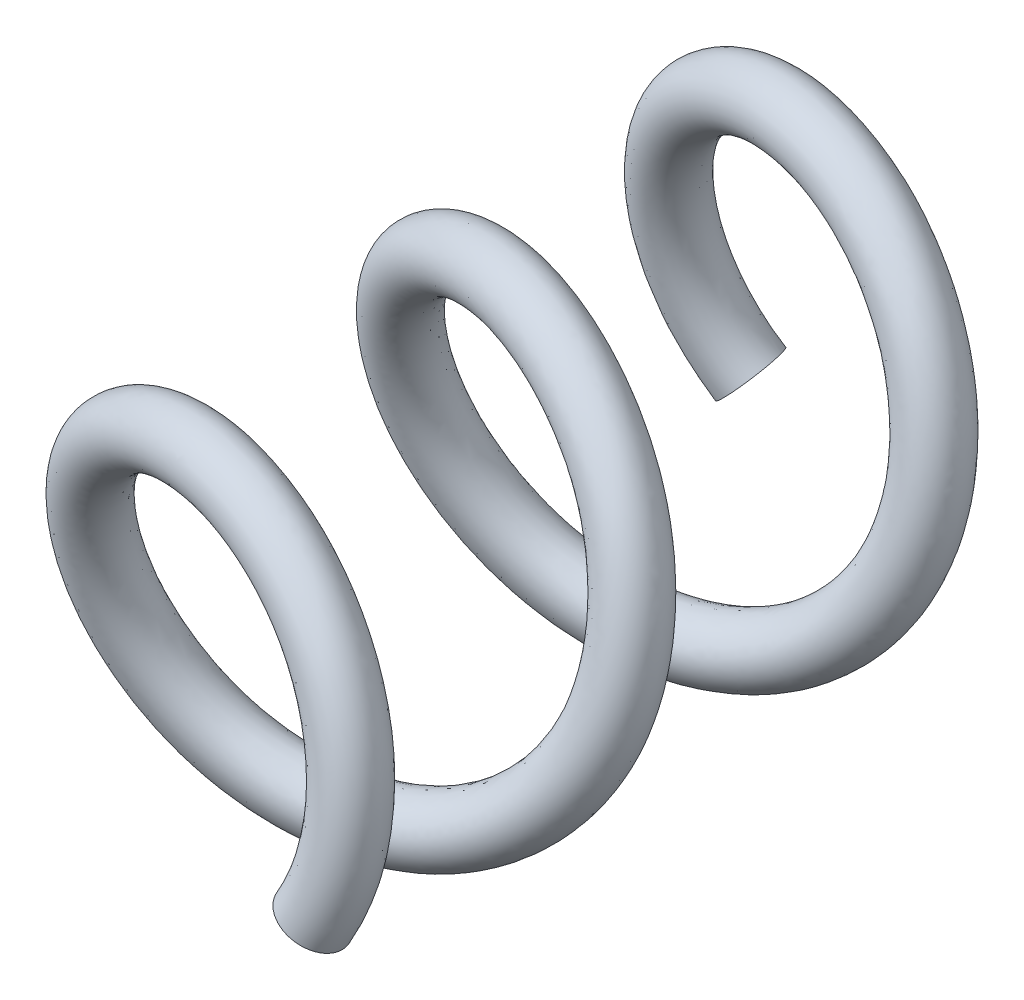
ISO-10303-21;
HEADER;
FILE_DESCRIPTION(('STEP AP214'),'2;1');
FILE_NAME('part.step','',(''),(''),'','','');
FILE_SCHEMA(('AUTOMOTIVE_DESIGN { 1 0 10303 214 1 1 1 1 }'));
ENDSEC;
DATA;
#1=APPLICATION_CONTEXT('core data for automotive mechanical design processes');
#2=APPLICATION_PROTOCOL_DEFINITION('international standard','automotive_design',2000,#1);
#3=PRODUCT_CONTEXT('',#1,'mechanical');
#4=PRODUCT('Part','Part','',(#3));
#5=PRODUCT_RELATED_PRODUCT_CATEGORY('part','',(#4));
#6=PRODUCT_DEFINITION_FORMATION('','',#4);
#7=PRODUCT_DEFINITION_CONTEXT('part definition',#1,'design');
#8=PRODUCT_DEFINITION('design','',#6,#7);
#9=PRODUCT_DEFINITION_SHAPE('','',#8);
#10=(LENGTH_UNIT() NAMED_UNIT(*) SI_UNIT(.MILLI.,.METRE.));
#11=(NAMED_UNIT(*) PLANE_ANGLE_UNIT() SI_UNIT($,.RADIAN.));
#12=(NAMED_UNIT(*) SI_UNIT($,.STERADIAN.) SOLID_ANGLE_UNIT());
#13=UNCERTAINTY_MEASURE_WITH_UNIT(LENGTH_MEASURE(1.E-05),#10,'distance_accuracy_value','');
#14=(GEOMETRIC_REPRESENTATION_CONTEXT(3) GLOBAL_UNCERTAINTY_ASSIGNED_CONTEXT((#13)) GLOBAL_UNIT_ASSIGNED_CONTEXT((#10,
#11,#12)) REPRESENTATION_CONTEXT('',''));
#15=CARTESIAN_POINT('',(0.,0.,0.));
#16=DIRECTION('',(0.,0.,1.));
#17=DIRECTION('',(1.,0.,0.));
#18=AXIS2_PLACEMENT_3D('',#15,#16,#17);
#19=CARTESIAN_POINT('',(-1.33608525893094,-32.7738420590162,0.));
#20=DIRECTION('',(-0.698317787676566,0.698317796807983,0.157176722436089));
#21=DIRECTION('',(-0.70710678580972,-0.707106776563375,0.));
#22=AXIS2_PLACEMENT_3D('',#19,#20,#21);
#23=PLANE('',#22);
#24=CARTESIAN_POINT('',(-1.33608525893094,-32.7738420590162,0.));
#25=DIRECTION('',(-0.698317787676566,0.698317796807983,0.157176722436089));
#26=DIRECTION('',(-0.70710678580972,-0.707106776563375,0.));
#27=AXIS2_PLACEMENT_3D('',#24,#25,#26);
#28=CIRCLE('',#27,0.5);
#29=CARTESIAN_POINT('',(-1.6896386518358,-33.1273954472979,0.));
#30=VERTEX_POINT('',#29);
#31=EDGE_CURVE('E45',#30,#30,#28,.T.);
#32=ORIENTED_EDGE('',*,*,#31,.F.);
#33=EDGE_LOOP('',(#32));
#34=FACE_BOUND('',#33,.T.);
#35=ADVANCED_FACE('F38',(#34),#23,.F.);
#36=CARTESIAN_POINT('',(3.45825465719374,-32.0144932146752,11.8));
#37=DIRECTION('',(-0.448347627232766,-0.879931749102734,0.157176722436089));
#38=DIRECTION('',(0.891006521220091,-0.453990505565118,0.));
#39=AXIS2_PLACEMENT_3D('',#36,#37,#38);
#40=PLANE('',#39);
#41=CARTESIAN_POINT('',(3.45825465719374,-32.0144932146752,11.8));
#42=DIRECTION('',(-0.448347627232766,-0.879931749102734,0.157176722436089));
#43=DIRECTION('',(0.891006521220091,-0.453990505565118,0.));
#44=AXIS2_PLACEMENT_3D('',#41,#42,#43);
#45=CIRCLE('',#44,0.5);
#46=CARTESIAN_POINT('',(3.90375791780379,-32.2414884674578,11.8));
#47=VERTEX_POINT('',#46);
#48=EDGE_CURVE('E12',#47,#47,#45,.T.);
#49=ORIENTED_EDGE('',*,*,#48,.T.);
#50=EDGE_LOOP('',(#49));
#51=FACE_BOUND('',#50,.T.);
#52=ADVANCED_FACE('F52',(#51),#40,.T.);
#53=CARTESIAN_POINT('',(-1.6896386518358,-33.1273954472979,0.));
#54=CARTESIAN_POINT('',(-2.32676041611821,-32.4902736717879,0.122916666666667));
#55=CARTESIAN_POINT('',(-2.67623916502679,-31.6352356646999,0.245833333333317));
#56=CARTESIAN_POINT('',(-2.74700579089875,-29.9663693075288,0.491666666666683));
#57=CARTESIAN_POINT('',(-2.47439288685123,-29.1571089661715,0.614583333333328));
#58=CARTESIAN_POINT('',(-1.52804588510786,-27.9120536905802,0.860416666666672));
#59=CARTESIAN_POINT('',(-0.859754827282546,-27.4763189547219,0.983333333333417));
#60=CARTESIAN_POINT('',(0.562211858433638,-27.082575432784,1.22916666666658));
#61=CARTESIAN_POINT('',(1.31252183080927,-27.122316791561,1.35208333333334));
#62=CARTESIAN_POINT('',(2.63018582276972,-27.596947314323,1.59791666666666));
#63=CARTESIAN_POINT('',(3.19630530596648,-28.0289845914169,1.7208333333332));
#64=CARTESIAN_POINT('',(3.99305904679965,-29.1013698505376,1.9666666666668));
#65=CARTESIAN_POINT('',(4.22403604929268,-29.7392949305052,2.08958333333342));
#66=CARTESIAN_POINT('',(4.32472764833531,-31.0149132873898,2.33541666666658));
#67=CARTESIAN_POINT('',(4.19566161607734,-31.651062243797,2.45833333333331));
#68=CARTESIAN_POINT('',(3.65109202261082,-32.7537014666493,2.70416666666669));
#69=CARTESIAN_POINT('',(3.23707563439816,-33.2195741880371,2.82708333333342));
#70=CARTESIAN_POINT('',(1.76427085370683,-34.2157521233612,3.19583333333317));
#71=CARTESIAN_POINT('',(0.489145181720713,-34.3121558186713,3.44166666666677));
#72=CARTESIAN_POINT('',(-1.56486029766487,-33.4734511244977,3.93333333333323));
#73=CARTESIAN_POINT('',(-2.33591465166483,-32.570198901732,4.17916666666691));
#74=CARTESIAN_POINT('',(-2.8736973086042,-30.4756737330022,4.67083333333309));
#75=CARTESIAN_POINT('',(-2.62230336910941,-29.3079983227883,4.91666666666691));
#76=CARTESIAN_POINT('',(-1.27023930891354,-27.6203465086722,5.4083333333331));
#77=CARTESIAN_POINT('',(-0.185525191472729,-27.1202864524136,5.65416666666641));
#78=CARTESIAN_POINT('',(1.97587068081203,-27.1882110561447,6.14583333333359));
#79=CARTESIAN_POINT('',(3.02704533093627,-27.755394123054,6.39166666666741));
#80=CARTESIAN_POINT('',(4.27047286405579,-29.5246125489054,6.8833333333326));
#81=CARTESIAN_POINT('',(4.44805178718395,-30.705768974836,7.12916666666691));
#82=CARTESIAN_POINT('',(3.77981399411904,-32.76239342292,7.6208333333331));
#83=CARTESIAN_POINT('',(2.94188329806941,-33.6135907708098,7.86666666666641));
#84=CARTESIAN_POINT('',(0.896008792389223,-34.3140501740139,8.3583333333336));
#85=CARTESIAN_POINT('',(-0.287791205398355,-34.155045954923,8.60416666666641));
#86=CARTESIAN_POINT('',(-2.07632227571688,-32.9395614922369,9.09583333333359));
#87=CARTESIAN_POINT('',(-2.69018342753264,-31.8861615451856,9.34166666666743));
#88=CARTESIAN_POINT('',(-2.72595032789113,-30.1434271826397,9.71041666666628));
#89=CARTESIAN_POINT('',(-2.59046215664956,-29.5440622746287,9.8333333333334));
#90=CARTESIAN_POINT('',(-2.01454409863973,-28.4650001293566,10.0791666666666));
#91=CARTESIAN_POINT('',(-1.57328335145128,-27.9866965311971,10.2020833333332));
#92=CARTESIAN_POINT('',(-0.463503690226651,-27.319372369502,10.4479166666668));
#93=CARTESIAN_POINT('',(0.205143158949004,-27.1325240940807,10.5708333333332));
#94=CARTESIAN_POINT('',(1.58560343167968,-27.1759860311025,10.8166666666668));
#95=CARTESIAN_POINT('',(2.29611920431782,-27.4090415353304,10.9395833333333));
#96=CARTESIAN_POINT('',(3.48428619787213,-28.3034671094135,11.1854166666667));
#97=CARTESIAN_POINT('',(3.95826428930019,-28.9673755168449,11.3083333333328));
#98=CARTESIAN_POINT('',(4.37605263629423,-30.5347877026318,11.5541666666673));
#99=CARTESIAN_POINT('',(4.31281526571595,-31.4386681986082,11.677083333333));
#100=CARTESIAN_POINT('',(3.90375791780379,-32.2414884674578,11.8));
#101=CARTESIAN_POINT('',(-1.57849792628322,-33.2385361743037,0.987570492635461));
#102=CARTESIAN_POINT('',(-2.24423132285937,-32.6300260302631,1.11048715930213));
#103=CARTESIAN_POINT('',(-2.63210780657307,-31.7906822870486,1.23340382596878));
#104=CARTESIAN_POINT('',(-2.77781927366554,-30.1249938912627,1.47923715930214));
#105=CARTESIAN_POINT('',(-2.54154833756292,-29.3034911489142,1.60215382596881));
#106=CARTESIAN_POINT('',(-1.65111382343089,-28.0159376672901,1.84798715930211));
#107=CARTESIAN_POINT('',(-1.00239058190288,-27.5501915604364,1.970903825969));
#108=CARTESIAN_POINT('',(0.401894013810126,-27.092590877519,2.21673715930192));
#109=CARTESIAN_POINT('',(1.15398867680855,-27.0986375899439,2.3396538259688));
#110=CARTESIAN_POINT('',(2.49296720336877,-27.5140949392468,2.58548715930212));
#111=CARTESIAN_POINT('',(3.0784884590461,-27.920709129341,2.70840382596855));
#112=CARTESIAN_POINT('',(3.92340048585569,-28.9573140625688,2.95423715930237));
#113=CARTESIAN_POINT('',(4.18302519504409,-29.5848665117796,3.07715382596888));
#114=CARTESIAN_POINT('',(4.34100179765882,-30.8559630474094,3.32298715930204));
#115=CARTESIAN_POINT('',(4.24050371049644,-31.4979080542426,3.44590382596878));
#116=CARTESIAN_POINT('',(3.74545103663005,-32.6250026098967,3.69173715930215));
#117=CARTESIAN_POINT('',(3.3523558904323,-33.1094678282405,3.81465382596901));
#118=CARTESIAN_POINT('',(1.92428710446829,-34.1717859433064,4.18340382596836));
#119=CARTESIAN_POINT('',(0.653490694119778,-34.325452516871,4.4292371593021));
#120=CARTESIAN_POINT('',(-1.43817903004553,-33.5789883508108,4.92090382596882));
#121=CARTESIAN_POINT('',(-2.24979630535632,-32.7103623552957,5.16673715930237));
#122=CARTESIAN_POINT('',(-2.88163913416828,-30.6399877332956,5.65840382596856));
#123=CARTESIAN_POINT('',(-2.68268273570748,-29.4610228155174,5.90423715930237));
#124=CARTESIAN_POINT('',(-1.40640712681963,-27.7126530016878,6.39590382596856));
#125=CARTESIAN_POINT('',(-0.3441495235795,-27.1638809996589,6.64173715930187));
#126=CARTESIAN_POINT('',(1.82029668256006,-27.1347424265229,7.13340382596906));
#127=CARTESIAN_POINT('',(2.89694218308523,-27.6547197260865,7.37923715930287));
#128=CARTESIAN_POINT('',(4.21982113178897,-29.3680987625973,7.87090382596806));
#129=CARTESIAN_POINT('',(4.45044299659464,-30.5412805393667,8.11673715930262));
#130=CARTESIAN_POINT('',(3.87456334336887,-32.6279139668589,8.60840382596831));
#131=CARTESIAN_POINT('',(3.07485790690644,-33.5167408008028,8.85423715930137));
#132=CARTESIAN_POINT('',(1.0604393759085,-34.3090755897007,9.34590382596956));
#133=CARTESIAN_POINT('',(-0.130501125607981,-34.2032330287624,9.59173715930287));
#134=CARTESIAN_POINT('',(-1.97361672895243,-33.0680672662306,10.0834038259681));
#135=CARTESIAN_POINT('',(-2.63478358123542,-32.04223437145,10.3292371593018));
#136=CARTESIAN_POINT('',(-2.74881256022546,-30.3011062153697,10.6979871593023));
#137=CARTESIAN_POINT('',(-2.6402404494617,-29.6956568538699,10.8209038259683));
#138=CARTESIAN_POINT('',(-2.11278052024577,-28.5907315903977,11.0667371593026));
#139=CARTESIAN_POINT('',(-1.69299925634454,-28.0926120155513,11.1896538259687));
#140=CARTESIAN_POINT('',(-0.613187544708828,-27.3754502737521,11.4354871593022));
#141=CARTESIAN_POINT('',(0.0470683904855341,-27.1585746496483,11.558403825968));
#142=CARTESIAN_POINT('',(1.42948043636728,-27.1400433806481,11.8042371593029));
#143=CARTESIAN_POINT('',(2.15046218069822,-27.3411913019681,11.9271538259695));
#144=CARTESIAN_POINT('',(3.37879571175126,-28.182259106631,12.1729871593015));
#145=CARTESIAN_POINT('',(3.88258835972035,-28.8248822791107,12.2959038259675));
#146=CARTESIAN_POINT('',(4.37076548112532,-30.3735325787063,12.5417371593035));
#147=CARTESIAN_POINT('',(4.34811924590295,-31.2802529156659,12.6646538259684));
#148=CARTESIAN_POINT('',(3.97511465748562,-32.1014429827832,12.7875704926355));
#149=CARTESIAN_POINT('',(-0.871391140473499,-32.5314293977404,0.987570492635461));
#150=CARTESIAN_POINT('',(-1.35508974827494,-32.1049540477153,1.11048715930213));
#151=CARTESIAN_POINT('',(-1.64311516224265,-31.5099068785188,1.23340382596878));
#152=CARTESIAN_POINT('',(-1.76860759604028,-30.3210374420434,1.47923715930214));
#153=CARTESIAN_POINT('',(-1.61022606239033,-29.7307519396439,1.60215382596881));
#154=CARTESIAN_POINT('',(-0.990176407895497,-28.798928535244,1.84798715930211));
#155=CARTESIAN_POINT('',(-0.532393469302145,-28.4576780661383,1.970903825969));
#156=CARTESIAN_POINT('',(0.465614929866506,-28.1125755300672,2.21673715930192));
#157=CARTESIAN_POINT('',(1.00333531510518,-28.1072675673553,2.3396538259688));
#158=CARTESIAN_POINT('',(1.96583841614949,-28.3871161937596,2.58548715930212));
#159=CARTESIAN_POINT('',(2.38961124874894,-28.6702911609178,2.70840382596855));
#160=CARTESIAN_POINT('',(3.00687935132306,-29.4005003045547,2.95423715930237));
#161=CARTESIAN_POINT('',(3.20051063225008,-29.8457884448311,3.07715382596888));
#162=CARTESIAN_POINT('',(3.32971820860782,-30.7524225926181,3.32298715930204));
#163=CARTESIAN_POINT('',(3.26609613168084,-31.2126107549715,3.44590382596878));
#164=CARTESIAN_POINT('',(2.92663477200007,-32.0246655335374,3.69173715930215));
#165=CARTESIAN_POINT('',(2.65183002318217,-32.3760242607208,3.81465382596901));
#166=CARTESIAN_POINT('',(1.64456260471828,-33.1537201109078,4.18340382596836));
#167=CARTESIAN_POINT('',(0.73808781509742,-33.2798427735769,4.4292371593021));
#168=CARTESIAN_POINT('',(-0.766723202017596,-32.7730085234117,4.92090382596882));
#169=CARTESIAN_POINT('',(-1.35803923477306,-32.1624545927854,5.16673715930237));
#170=CARTESIAN_POINT('',(-1.83622987924233,-30.6905157341417,5.65840382596856));
#171=CARTESIAN_POINT('',(-1.70910032250731,-29.8451723617348,5.90423715930237));
#172=CARTESIAN_POINT('',(-0.819128733519049,-28.578988778347,6.39590382596856));
#173=CARTESIAN_POINT('',(-0.0667894503508079,-28.1730910763701,6.64173715930187));
#174=CARTESIAN_POINT('',(1.48011507810521,-28.1245454701323,7.13340382596906));
#175=CARTESIAN_POINT('',(2.25642496521531,-28.4824704631809,7.37923715930287));
#176=CARTESIAN_POINT('',(3.22403890728988,-29.690358518891,7.87090382596806));
#177=CARTESIAN_POINT('',(3.40392393880473,-30.5260670308218,8.11673715930262));
#178=CARTESIAN_POINT('',(3.0189693726093,-32.0250934742175,8.60840382596831));
#179=CARTESIAN_POINT('',(2.458672707807,-32.6707210672478,8.85423715930137));
#180=CARTESIAN_POINT('',(1.02878975098301,-33.262924601365,9.34590382596956));
#181=CARTESIAN_POINT('',(0.17607782000824,-33.202511819202,9.59173715930287));
#182=CARTESIAN_POINT('',(-1.15602890804919,-32.4146273345919,10.0834038259681));
#183=CARTESIAN_POINT('',(-1.64180686149825,-31.689765854237,10.3292371593018));
#184=CARTESIAN_POINT('',(-1.74561672889285,-30.4465618017956,10.6979871593023));
#185=CARTESIAN_POINT('',(-1.67575552515492,-30.0123595566553,10.8209038259683));
#186=CARTESIAN_POINT('',(-1.31284361424527,-29.2157377623369,11.0667371593026));
#187=CARTESIAN_POINT('',(-1.01913685030249,-28.8542763576894,11.1896538259687));
#188=CARTESIAN_POINT('',(-0.256405042946246,-28.327778660308,11.4354871593022));
#189=CARTESIAN_POINT('',(0.212808935044058,-28.1642882566861,11.558403825968));
#190=CARTESIAN_POINT('',(1.20080376021422,-28.1333392891803,11.8042371593029));
#191=CARTESIAN_POINT('',(1.718780998451,-28.2678999224378,11.9271538259695));
#192=CARTESIAN_POINT('',(2.60763824706308,-28.853417561183,12.1729871593015));
#193=CARTESIAN_POINT('',(2.97600858425635,-29.3063526164926,12.2959038259675));
#194=CARTESIAN_POINT('',(3.34481760903486,-30.4071708623332,12.5417371593035));
#195=CARTESIAN_POINT('',(3.34023919542903,-31.0556396291128,12.6646538259684));
#196=CARTESIAN_POINT('',(3.08410813626553,-31.6474524772181,12.7875704926355));
#197=CARTESIAN_POINT('',(-0.982531866026078,-32.4202886707345,0.));
#198=CARTESIAN_POINT('',(-1.43761884153358,-31.9652016892401,0.122916666666667));
#199=CARTESIAN_POINT('',(-1.68724652069561,-31.3544602561701,0.245833333333317));
#200=CARTESIAN_POINT('',(-1.73779411327426,-30.1624128583095,0.491666666666683));
#201=CARTESIAN_POINT('',(-1.5430706116772,-29.5843697569005,0.614583333333328));
#202=CARTESIAN_POINT('',(-0.867108469573884,-28.6950445585348,0.860416666666672));
#203=CARTESIAN_POINT('',(-0.389757714680458,-28.3838054604252,0.983333333333417));
#204=CARTESIAN_POINT('',(0.62593277448867,-28.1025600853309,1.22916666666658));
#205=CARTESIAN_POINT('',(1.16186846910526,-28.1309467689718,1.35208333333334));
#206=CARTESIAN_POINT('',(2.10305703555108,-28.4699685688364,1.59791666666666));
#207=CARTESIAN_POINT('',(2.50742809566917,-28.7785666229937,1.7208333333332));
#208=CARTESIAN_POINT('',(3.07653791226716,-29.5445560925235,1.9666666666668));
#209=CARTESIAN_POINT('',(3.24152148649808,-30.0002168635561,2.08958333333342));
#210=CARTESIAN_POINT('',(3.31344405928491,-30.9113728325991,2.33541666666658));
#211=CARTESIAN_POINT('',(3.22125403726118,-31.3657649445259,2.45833333333331));
#212=CARTESIAN_POINT('',(2.83227575798141,-32.15336439029,2.70416666666669));
#213=CARTESIAN_POINT('',(2.53654976714693,-32.4861306205163,2.82708333333342));
#214=CARTESIAN_POINT('',(1.484546353959,-33.1976862909647,3.19583333333317));
#215=CARTESIAN_POINT('',(0.573742302697331,-33.266546075373,3.44166666666677));
#216=CARTESIAN_POINT('',(-0.893404469635913,-32.6674712971027,3.93333333333323));
#217=CARTESIAN_POINT('',(-1.44415758108256,-32.0222911392226,4.17916666666691));
#218=CARTESIAN_POINT('',(-1.82828805367725,-30.5262017338474,4.67083333333309));
#219=CARTESIAN_POINT('',(-1.64872095590524,-29.6921478690076,4.91666666666691));
#220=CARTESIAN_POINT('',(-0.682960915616938,-28.4866822853294,5.4083333333331));
#221=CARTESIAN_POINT('',(0.0918348817549682,-28.1294965291259,5.65416666666641));
#222=CARTESIAN_POINT('',(1.63568907635818,-28.1780140997532,6.14583333333359));
#223=CARTESIAN_POINT('',(2.38652811306635,-28.5831448601503,6.39166666666741));
#224=CARTESIAN_POINT('',(3.2746906395567,-29.8468723051972,6.8833333333326));
#225=CARTESIAN_POINT('',(3.40153272939604,-30.6905554662951,7.12916666666691));
#226=CARTESIAN_POINT('',(2.92422002335748,-32.1595729302746,7.6208333333331));
#227=CARTESIAN_POINT('',(2.32569809897096,-32.7675710372568,7.86666666666641));
#228=CARTESIAN_POINT('',(0.86435916746273,-33.2678991856762,8.3583333333336));
#229=CARTESIAN_POINT('',(0.0187877402178686,-33.1543247453626,8.60416666666641));
#230=CARTESIAN_POINT('',(-1.25873445481363,-32.2861215605982,9.09583333333359));
#231=CARTESIAN_POINT('',(-1.69720670779655,-31.5336930279715,9.34166666666743));
#232=CARTESIAN_POINT('',(-1.72275449655798,-30.2888827690661,9.71041666666628));
#233=CARTESIAN_POINT('',(-1.62597723234446,-29.8607649774135,9.8333333333334));
#234=CARTESIAN_POINT('',(-1.21460719263754,-29.0900063012963,10.0791666666666));
#235=CARTESIAN_POINT('',(-0.899420945409232,-28.7483608733341,10.2020833333332));
#236=CARTESIAN_POINT('',(-0.106721188464077,-28.2717007560591,10.4479166666668));
#237=CARTESIAN_POINT('',(0.370883703507528,-28.1382377011179,10.5708333333332));
#238=CARTESIAN_POINT('',(1.35692675552663,-28.1692819396354,10.8166666666668));
#239=CARTESIAN_POINT('',(1.86443802207026,-28.3357501558028,10.9395833333333));
#240=CARTESIAN_POINT('',(2.71312873318428,-28.9746255639628,11.1854166666667));
#241=CARTESIAN_POINT('',(3.05168451383619,-29.4488458542253,11.3083333333328));
#242=CARTESIAN_POINT('',(3.35010476420377,-30.5684259862602,11.5541666666673));
#243=CARTESIAN_POINT('',(3.30493521522974,-31.2140549120567,11.677083333333));
#244=CARTESIAN_POINT('',(3.0127513965837,-31.7874979618927,11.8));
#245=CARTESIAN_POINT('',(-1.09367259157866,-32.3091479437286,-0.987570492635461));
#246=CARTESIAN_POINT('',(-1.52014793479222,-31.825449330765,-0.864653825968794));
#247=CARTESIAN_POINT('',(-1.73137787914857,-31.1990136338213,-0.741737159302145));
#248=CARTESIAN_POINT('',(-1.70698063050822,-30.0037882745756,-0.495903825968778));
#249=CARTESIAN_POINT('',(-1.47591516096409,-29.4379875741571,-0.372987159302155));
#250=CARTESIAN_POINT('',(-0.744040531252277,-28.5911605818256,-0.127153825968767));
#251=CARTESIAN_POINT('',(-0.247121960058768,-28.3099328547121,-0.00423715930217093));
#252=CARTESIAN_POINT('',(0.786250619110838,-28.0925446405947,0.241596174031249));
#253=CARTESIAN_POINT('',(1.32040162310535,-28.1546259705883,0.364512840697882));
#254=CARTESIAN_POINT('',(2.24027565495267,-28.5528209439132,0.610346174031196));
#255=CARTESIAN_POINT('',(2.6252449425894,-28.8868420850696,0.733262840697856));
#256=CARTESIAN_POINT('',(3.14619647321127,-29.6886118804923,0.979096174031222));
#257=CARTESIAN_POINT('',(3.28253234074607,-30.1546452822812,1.10201284069796));
#258=CARTESIAN_POINT('',(3.29716990996199,-31.0703230725802,1.34784617403112));
#259=CARTESIAN_POINT('',(3.17641194284152,-31.5189191340803,1.47076284069785));
#260=CARTESIAN_POINT('',(2.73791674396276,-32.2820632470426,1.71659617403122));
#261=CARTESIAN_POINT('',(2.42126951111169,-32.5962369803118,1.83951284069782));
#262=CARTESIAN_POINT('',(1.32453010319973,-33.2416524710216,2.20826284069798));
#263=CARTESIAN_POINT('',(0.409396790297239,-33.2532493771692,2.45409617403143));
#264=CARTESIAN_POINT('',(-1.02008573725423,-32.5619340707937,2.94576284069765));
#265=CARTESIAN_POINT('',(-1.53027592739206,-31.8821276856598,3.19159617403144));
#266=CARTESIAN_POINT('',(-1.82034622811217,-30.3618877335531,3.68326284069763));
#267=CARTESIAN_POINT('',(-1.58834158930317,-29.5391233762805,3.92909617403144));
#268=CARTESIAN_POINT('',(-0.546793097714828,-28.3943757923119,4.42076284069763));
#269=CARTESIAN_POINT('',(0.250459213860741,-28.0859019818816,4.66659617403095));
#270=CARTESIAN_POINT('',(1.79126307461116,-28.231482729374,5.15826284069813));
#271=CARTESIAN_POINT('',(2.51663126091739,-28.6838192571198,5.40409617403194));
#272=CARTESIAN_POINT('',(3.32534237182352,-30.0033860915033,5.89576284069713));
#273=CARTESIAN_POINT('',(3.39914151998735,-30.8550439017684,6.1415961740312));
#274=CARTESIAN_POINT('',(2.82947067410566,-32.2940523863317,6.63326284069789));
#275=CARTESIAN_POINT('',(2.19272349013493,-32.8644210072658,6.87909617403145));
#276=CARTESIAN_POINT('',(0.699928583942454,-33.2728737699874,7.37076284069764));
#277=CARTESIAN_POINT('',(-0.138502339572505,-33.1061376715232,7.61659617402995));
#278=CARTESIAN_POINT('',(-1.36144000157808,-32.1576157866045,8.10826284069913));
#279=CARTESIAN_POINT('',(-1.75260655409485,-31.3776202017061,8.35409617403304));
#280=CARTESIAN_POINT('',(-1.69989226422312,-30.1312037363366,8.72284617403029));
#281=CARTESIAN_POINT('',(-1.576198939534,-29.7091703981717,8.8457628406985));
#282=CARTESIAN_POINT('',(-1.11637077102981,-28.9642748402558,9.09159617403058));
#283=CARTESIAN_POINT('',(-0.779705040515971,-28.6424453889788,9.21451284069777));
#284=CARTESIAN_POINT('',(0.0429626660180954,-28.2156228518103,9.46034617403131));
#285=CARTESIAN_POINT('',(0.528958471970994,-28.1121871455496,9.58326284069833));
#286=CARTESIAN_POINT('',(1.51304975083902,-28.2052245900905,9.82909617403075));
#287=CARTESIAN_POINT('',(2.01009504568952,-28.4036003891678,9.95201284069717));
#288=CARTESIAN_POINT('',(2.81861921930548,-29.0958335667425,10.1978461740319));
#289=CARTESIAN_POINT('',(3.12736044341602,-29.5913390919581,10.320762840698));
#290=CARTESIAN_POINT('',(3.35539191937267,-30.7296811101872,10.5665961740311));
#291=CARTESIAN_POINT('',(3.26963123503045,-31.3724701950007,10.6895128406975));
#292=CARTESIAN_POINT('',(2.94139465690188,-31.9275434465672,10.8124295073645));
#293=CARTESIAN_POINT('',(-1.80077937738838,-33.016254720292,-0.987570492635461));
#294=CARTESIAN_POINT('',(-2.40928950937706,-32.3505213133128,-0.864653825968794));
#295=CARTESIAN_POINT('',(-2.72037052348051,-31.4797890423511,-0.741737159302145));
#296=CARTESIAN_POINT('',(-2.71619230813196,-29.8077447237949,-0.495903825968778));
#297=CARTESIAN_POINT('',(-2.40723743613954,-29.0107267834288,-0.372987159302155));
#298=CARTESIAN_POINT('',(-1.40497794678482,-27.8081697138703,-0.127153825968767));
#299=CARTESIAN_POINT('',(-0.717119072662201,-27.4024463490075,-0.00423715930217091));
#300=CARTESIAN_POINT('',(0.722529703057156,-27.0725599880491,0.241596174031249));
#301=CARTESIAN_POINT('',(1.47105498480999,-27.1459959931782,0.364512840697882));
#302=CARTESIAN_POINT('',(2.76740444217067,-27.6797996893992,0.610346174031196));
#303=CARTESIAN_POINT('',(3.31412215288687,-28.1372600534928,0.733262840697856));
#304=CARTESIAN_POINT('',(4.0627176077436,-29.2454256385064,0.979096174031222));
#305=CARTESIAN_POINT('',(4.26504690354126,-29.8937233492309,1.10201284069796));
#306=CARTESIAN_POINT('',(4.30845349901182,-31.1738635273703,1.34784617403112));
#307=CARTESIAN_POINT('',(4.15081952165825,-31.8042164333514,1.47076284069785));
#308=CARTESIAN_POINT('',(3.5567330085916,-32.8824003234019,1.71659617403122));
#309=CARTESIAN_POINT('',(3.12179537836401,-33.3296805478337,1.83951284069782));
#310=CARTESIAN_POINT('',(1.60425460294537,-34.2597183034159,2.20826284069798));
#311=CARTESIAN_POINT('',(0.324799669321644,-34.2988591204715,2.45409617403143));
#312=CARTESIAN_POINT('',(-1.69154156528421,-33.3679138981846,2.94576284069765));
#313=CARTESIAN_POINT('',(-2.42203299797333,-32.4300354481682,3.19159617403144));
#314=CARTESIAN_POINT('',(-2.86575548304011,-30.3113597327089,3.68326284069763));
#315=CARTESIAN_POINT('',(-2.56192400251132,-29.1549738300591,3.92909617403144));
#316=CARTESIAN_POINT('',(-1.13407149100742,-27.5280400156567,4.42076284069763));
#317=CARTESIAN_POINT('',(-0.0269008593659582,-27.0766919051683,4.66659617403095));
#318=CARTESIAN_POINT('',(2.13144467906401,-27.2416796857665,5.15826284069813));
#319=CARTESIAN_POINT('',(3.15714847878731,-27.8560685200214,5.40409617403194));
#320=CARTESIAN_POINT('',(4.32112459632261,-29.6811263352135,5.89576284069713));
#321=CARTESIAN_POINT('',(4.44566057777327,-30.8702574103053,6.1415961740312));
#322=CARTESIAN_POINT('',(3.68506464486922,-32.8968728789811,6.63326284069789));
#323=CARTESIAN_POINT('',(2.80890868923237,-33.7104407408168,6.87909617403145));
#324=CARTESIAN_POINT('',(0.731578208869946,-34.3190247583271,7.37076284069764));
#325=CARTESIAN_POINT('',(-0.445081285188728,-34.1068588810836,7.61659617402995));
#326=CARTESIAN_POINT('',(-2.17902782248132,-32.8110557182432,8.10826284069913));
#327=CARTESIAN_POINT('',(-2.74558327382988,-31.7300887189212,8.35409617403304));
#328=CARTESIAN_POINT('',(-2.7030880955568,-29.9857481499097,8.72284617403029));
#329=CARTESIAN_POINT('',(-2.54068386383741,-29.3924676953874,8.8457628406985));
#330=CARTESIAN_POINT('',(-1.91630767703369,-28.3392686683154,9.09159617403058));
#331=CARTESIAN_POINT('',(-1.45356744655802,-27.880781046843,9.21451284069777));
#332=CARTESIAN_POINT('',(-0.313819835744482,-27.263294465252,9.46034617403131));
#333=CARTESIAN_POINT('',(0.36321792741247,-27.1064735385131,9.58326284069833));
#334=CARTESIAN_POINT('',(1.74172642699207,-27.2119286815569,9.82909617403075));
#335=CARTESIAN_POINT('',(2.44177622793742,-27.4768917686926,9.95201284069717));
#336=CARTESIAN_POINT('',(3.58977668399299,-28.424675112196,10.1978461740319));
#337=CARTESIAN_POINT('',(4.03394021888002,-29.1098687545791,10.320762840698));
#338=CARTESIAN_POINT('',(4.38133979146313,-30.6960428265573,10.5665961740311));
#339=CARTESIAN_POINT('',(4.27751128552896,-31.5970834815506,10.6895128406975));
#340=CARTESIAN_POINT('',(3.83240117812196,-32.3815339521324,10.8124295073645));
#341=CARTESIAN_POINT('',(-1.6896386518358,-33.1273954472979,0.));
#342=CARTESIAN_POINT('',(-2.32676041611821,-32.4902736717879,0.122916666666667));
#343=CARTESIAN_POINT('',(-2.67623916502679,-31.6352356646999,0.245833333333317));
#344=CARTESIAN_POINT('',(-2.74700579089875,-29.9663693075288,0.491666666666683));
#345=CARTESIAN_POINT('',(-2.47439288685123,-29.1571089661715,0.614583333333328));
#346=CARTESIAN_POINT('',(-1.52804588510786,-27.9120536905802,0.860416666666672));
#347=CARTESIAN_POINT('',(-0.859754827282546,-27.4763189547219,0.983333333333417));
#348=CARTESIAN_POINT('',(0.562211858433638,-27.082575432784,1.22916666666658));
#349=CARTESIAN_POINT('',(1.31252183080927,-27.122316791561,1.35208333333334));
#350=CARTESIAN_POINT('',(2.63018582276972,-27.596947314323,1.59791666666666));
#351=CARTESIAN_POINT('',(3.19630530596648,-28.0289845914169,1.7208333333332));
#352=CARTESIAN_POINT('',(3.99305904679965,-29.1013698505376,1.9666666666668));
#353=CARTESIAN_POINT('',(4.22403604929268,-29.7392949305052,2.08958333333342));
#354=CARTESIAN_POINT('',(4.32472764833531,-31.0149132873898,2.33541666666658));
#355=CARTESIAN_POINT('',(4.19566161607734,-31.651062243797,2.45833333333331));
#356=CARTESIAN_POINT('',(3.65109202261082,-32.7537014666493,2.70416666666669));
#357=CARTESIAN_POINT('',(3.23707563439816,-33.2195741880371,2.82708333333342));
#358=CARTESIAN_POINT('',(1.76427085370683,-34.2157521233612,3.19583333333317));
#359=CARTESIAN_POINT('',(0.489145181720713,-34.3121558186713,3.44166666666677));
#360=CARTESIAN_POINT('',(-1.56486029766487,-33.4734511244977,3.93333333333323));
#361=CARTESIAN_POINT('',(-2.33591465166483,-32.570198901732,4.17916666666691));
#362=CARTESIAN_POINT('',(-2.8736973086042,-30.4756737330022,4.67083333333309));
#363=CARTESIAN_POINT('',(-2.62230336910941,-29.3079983227883,4.91666666666691));
#364=CARTESIAN_POINT('',(-1.27023930891354,-27.6203465086722,5.4083333333331));
#365=CARTESIAN_POINT('',(-0.185525191472729,-27.1202864524136,5.65416666666641));
#366=CARTESIAN_POINT('',(1.97587068081203,-27.1882110561447,6.14583333333359));
#367=CARTESIAN_POINT('',(3.02704533093627,-27.755394123054,6.39166666666741));
#368=CARTESIAN_POINT('',(4.27047286405579,-29.5246125489054,6.8833333333326));
#369=CARTESIAN_POINT('',(4.44805178718395,-30.705768974836,7.12916666666691));
#370=CARTESIAN_POINT('',(3.77981399411904,-32.76239342292,7.6208333333331));
#371=CARTESIAN_POINT('',(2.94188329806941,-33.6135907708098,7.86666666666641));
#372=CARTESIAN_POINT('',(0.896008792389223,-34.3140501740139,8.3583333333336));
#373=CARTESIAN_POINT('',(-0.287791205398355,-34.155045954923,8.60416666666641));
#374=CARTESIAN_POINT('',(-2.07632227571688,-32.9395614922369,9.09583333333359));
#375=CARTESIAN_POINT('',(-2.69018342753264,-31.8861615451856,9.34166666666743));
#376=CARTESIAN_POINT('',(-2.72595032789113,-30.1434271826397,9.71041666666628));
#377=CARTESIAN_POINT('',(-2.59046215664956,-29.5440622746287,9.8333333333334));
#378=CARTESIAN_POINT('',(-2.01454409863973,-28.4650001293566,10.0791666666666));
#379=CARTESIAN_POINT('',(-1.57328335145128,-27.9866965311971,10.2020833333332));
#380=CARTESIAN_POINT('',(-0.463503690226651,-27.319372369502,10.4479166666668));
#381=CARTESIAN_POINT('',(0.205143158949004,-27.1325240940807,10.5708333333332));
#382=CARTESIAN_POINT('',(1.58560343167968,-27.1759860311025,10.8166666666668));
#383=CARTESIAN_POINT('',(2.29611920431782,-27.4090415353304,10.9395833333333));
#384=CARTESIAN_POINT('',(3.48428619787213,-28.3034671094135,11.1854166666667));
#385=CARTESIAN_POINT('',(3.95826428930019,-28.9673755168449,11.3083333333328));
#386=CARTESIAN_POINT('',(4.37605263629423,-30.5347877026318,11.5541666666673));
#387=CARTESIAN_POINT('',(4.31281526571595,-31.4386681986082,11.677083333333));
#388=CARTESIAN_POINT('',(3.90375791780379,-32.2414884674578,11.8));
#389=(BOUNDED_SURFACE() B_SPLINE_SURFACE(3,3,((#53,#54,#55,#56,#57,#58,#59,#60,#61,#62,#63,#64,
#65,#66,#67,#68,#69,#70,#71,#72,#73,#74,#75,#76,#77,#78,#79,#80,#81,#82,#83,#84,#85,#86,#87,#88,
#89,#90,#91,#92,#93,#94,#95,#96,#97,#98,#99,#100),(#101,#102,#103,#104,#105,#106,#107,#108,#109,
#110,#111,#112,#113,#114,#115,#116,#117,#118,#119,#120,#121,#122,#123,#124,#125,#126,#127,#128,
#129,#130,#131,#132,#133,#134,#135,#136,#137,#138,#139,#140,#141,#142,#143,#144,#145,#146,#147,
#148),(#149,#150,#151,#152,#153,#154,#155,#156,#157,#158,#159,#160,#161,#162,#163,#164,#165,
#166,#167,#168,#169,#170,#171,#172,#173,#174,#175,#176,#177,#178,#179,#180,#181,#182,#183,#184,
#185,#186,#187,#188,#189,#190,#191,#192,#193,#194,#195,#196),(#197,#198,#199,#200,#201,#202,
#203,#204,#205,#206,#207,#208,#209,#210,#211,#212,#213,#214,#215,#216,#217,#218,#219,#220,#221,
#222,#223,#224,#225,#226,#227,#228,#229,#230,#231,#232,#233,#234,#235,#236,#237,#238,#239,#240,
#241,#242,#243,#244),(#245,#246,#247,#248,#249,#250,#251,#252,#253,#254,#255,#256,#257,#258,
#259,#260,#261,#262,#263,#264,#265,#266,#267,#268,#269,#270,#271,#272,#273,#274,#275,#276,#277,
#278,#279,#280,#281,#282,#283,#284,#285,#286,#287,#288,#289,#290,#291,#292),(#293,#294,#295,
#296,#297,#298,#299,#300,#301,#302,#303,#304,#305,#306,#307,#308,#309,#310,#311,#312,#313,#314,
#315,#316,#317,#318,#319,#320,#321,#322,#323,#324,#325,#326,#327,#328,#329,#330,#331,#332,#333,
#334,#335,#336,#337,#338,#339,#340),(#341,#342,#343,#344,#345,#346,#347,#348,#349,#350,#351,
#352,#353,#354,#355,#356,#357,#358,#359,#360,#361,#362,#363,#364,#365,#366,#367,#368,#369,#370,
#371,#372,#373,#374,#375,#376,#377,#378,#379,#380,#381,#382,#383,#384,#385,#386,#387,#388)),
.UNSPECIFIED.,.T.,.F.,.F.) B_SPLINE_SURFACE_WITH_KNOTS((4,3,4),(4,2,2,2,2,2,2,2,2,2,2,2,2,2,2,2,
2,2,2,2,2,2,2,4),(0.,0.5,1.),(0.,0.03125,0.0625,0.09375,0.125,0.15625,0.1875,0.21875,0.25,
0.3125,0.375,0.4375,0.5,0.5625,0.625,0.6875,0.75,0.8125,0.84375,0.875,0.90625,0.9375,0.96875,
1.),.UNSPECIFIED.) GEOMETRIC_REPRESENTATION_ITEM() RATIONAL_B_SPLINE_SURFACE(((1.,1.,1.,1.,1.,
1.,1.,1.,1.,1.,1.,1.,1.,1.,1.,1.,1.,1.,1.,1.,1.,1.,1.,1.,1.,1.,1.,1.,1.,1.,1.,1.,1.,1.,1.,1.,1.,
1.,1.,1.,1.,1.,1.,1.,1.,1.,1.,1.),(0.333333333333333,0.333333333333333,0.333333333333333,
0.333333333333333,0.333333333333333,0.333333333333333,0.333333333333333,0.333333333333333,
0.333333333333333,0.333333333333333,0.333333333333333,0.333333333333333,0.333333333333333,
0.333333333333333,0.333333333333333,0.333333333333333,0.333333333333333,0.333333333333333,
0.333333333333333,0.333333333333333,0.333333333333333,0.333333333333333,0.333333333333333,
0.333333333333333,0.333333333333333,0.333333333333333,0.333333333333333,0.333333333333333,
0.333333333333333,0.333333333333333,0.333333333333333,0.333333333333333,0.333333333333333,
0.333333333333333,0.333333333333333,0.333333333333333,0.333333333333333,0.333333333333333,
0.333333333333333,0.333333333333333,0.333333333333333,0.333333333333333,0.333333333333333,
0.333333333333333,0.333333333333333,0.333333333333333,0.333333333333333,0.333333333333333),
(0.333333333333333,0.333333333333333,0.333333333333333,0.333333333333333,0.333333333333333,
0.333333333333333,0.333333333333333,0.333333333333333,0.333333333333333,0.333333333333333,
0.333333333333333,0.333333333333333,0.333333333333333,0.333333333333333,0.333333333333333,
0.333333333333333,0.333333333333333,0.333333333333333,0.333333333333333,0.333333333333333,
0.333333333333333,0.333333333333333,0.333333333333333,0.333333333333333,0.333333333333333,
0.333333333333333,0.333333333333333,0.333333333333333,0.333333333333333,0.333333333333333,
0.333333333333333,0.333333333333333,0.333333333333333,0.333333333333333,0.333333333333333,
0.333333333333333,0.333333333333333,0.333333333333333,0.333333333333333,0.333333333333333,
0.333333333333333,0.333333333333333,0.333333333333333,0.333333333333333,0.333333333333333,
0.333333333333333,0.333333333333333,0.333333333333333),(1.,1.,1.,1.,1.,1.,1.,1.,1.,1.,1.,1.,1.,
1.,1.,1.,1.,1.,1.,1.,1.,1.,1.,1.,1.,1.,1.,1.,1.,1.,1.,1.,1.,1.,1.,1.,1.,1.,1.,1.,1.,1.,1.,1.,1.,
1.,1.,1.),(0.333333333333333,0.333333333333333,0.333333333333333,0.333333333333333,
0.333333333333333,0.333333333333333,0.333333333333333,0.333333333333333,0.333333333333333,
0.333333333333333,0.333333333333333,0.333333333333333,0.333333333333333,0.333333333333333,
0.333333333333333,0.333333333333333,0.333333333333333,0.333333333333333,0.333333333333333,
0.333333333333333,0.333333333333333,0.333333333333333,0.333333333333333,0.333333333333333,
0.333333333333333,0.333333333333333,0.333333333333333,0.333333333333333,0.333333333333333,
0.333333333333333,0.333333333333333,0.333333333333333,0.333333333333333,0.333333333333333,
0.333333333333333,0.333333333333333,0.333333333333333,0.333333333333333,0.333333333333333,
0.333333333333333,0.333333333333333,0.333333333333333,0.333333333333333,0.333333333333333,
0.333333333333333,0.333333333333333,0.333333333333333,0.333333333333333),(0.333333333333333,
0.333333333333333,0.333333333333333,0.333333333333333,0.333333333333333,0.333333333333333,
0.333333333333333,0.333333333333333,0.333333333333333,0.333333333333333,0.333333333333333,
0.333333333333333,0.333333333333333,0.333333333333333,0.333333333333333,0.333333333333333,
0.333333333333333,0.333333333333333,0.333333333333333,0.333333333333333,0.333333333333333,
0.333333333333333,0.333333333333333,0.333333333333333,0.333333333333333,0.333333333333333,
0.333333333333333,0.333333333333333,0.333333333333333,0.333333333333333,0.333333333333333,
0.333333333333333,0.333333333333333,0.333333333333333,0.333333333333333,0.333333333333333,
0.333333333333333,0.333333333333333,0.333333333333333,0.333333333333333,0.333333333333333,
0.333333333333333,0.333333333333333,0.333333333333333,0.333333333333333,0.333333333333333,
0.333333333333333,0.333333333333333),(1.,1.,1.,1.,1.,1.,1.,1.,1.,1.,1.,1.,1.,1.,1.,1.,1.,1.,1.,
1.,1.,1.,1.,1.,1.,1.,1.,1.,1.,1.,1.,1.,1.,1.,1.,1.,1.,1.,1.,1.,1.,1.,1.,1.,1.,1.,1.,1.))) REPRESENTATION_ITEM('') SURFACE());
#390=ORIENTED_EDGE('',*,*,#48,.F.);
#391=EDGE_LOOP('',(#390));
#392=FACE_BOUND('',#391,.T.);
#393=ORIENTED_EDGE('',*,*,#31,.T.);
#394=EDGE_LOOP('',(#393));
#395=FACE_BOUND('',#394,.T.);
#396=ADVANCED_FACE('F54',(#392,#395),#389,.T.);
#397=CLOSED_SHELL('',(#35,#52,#396));
#398=MANIFOLD_SOLID_BREP('B2',#397);
#399=ADVANCED_BREP_SHAPE_REPRESENTATION('',(#18,#398),#14);
#400=SHAPE_DEFINITION_REPRESENTATION(#9,#399);
ENDSEC;
END-ISO-10303-21;
